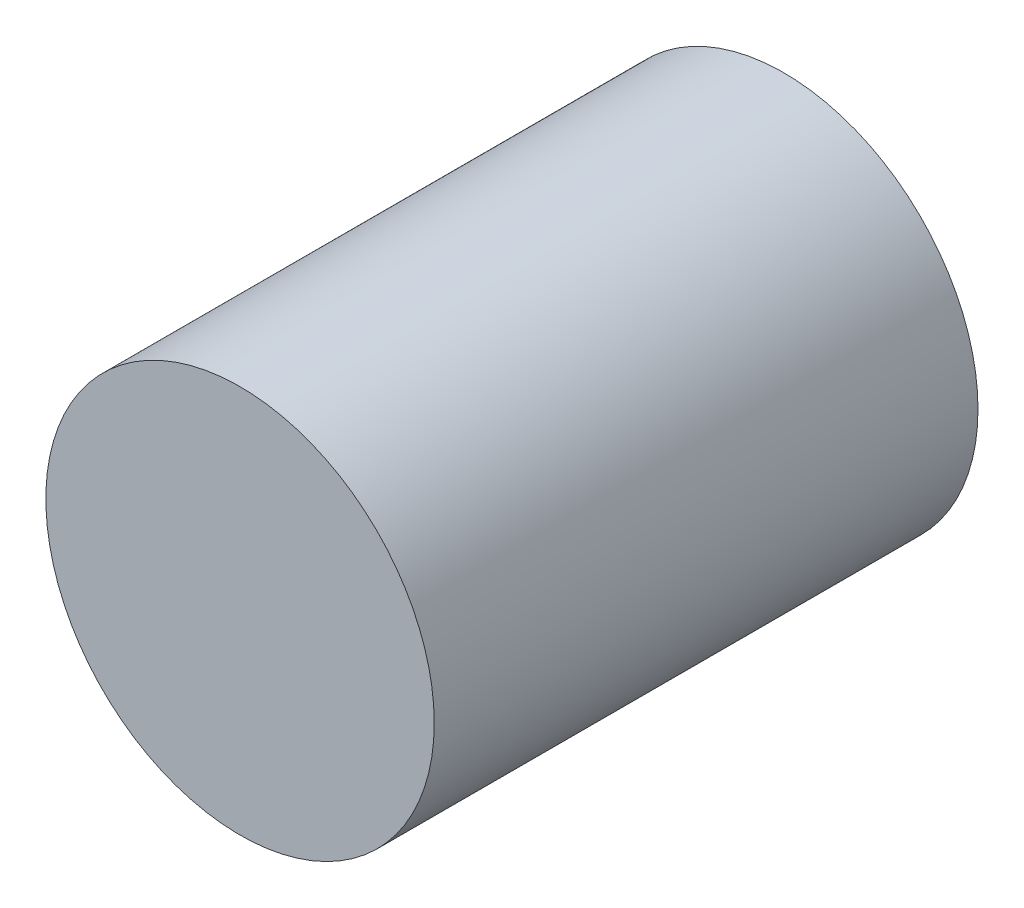
ISO-10303-21;
HEADER;
FILE_DESCRIPTION(('STEP AP214'),'2;1');
FILE_NAME('part.step','',(''),(''),'','','');
FILE_SCHEMA(('AUTOMOTIVE_DESIGN { 1 0 10303 214 1 1 1 1 }'));
ENDSEC;
DATA;
#1=APPLICATION_CONTEXT('core data for automotive mechanical design processes');
#2=APPLICATION_PROTOCOL_DEFINITION('international standard','automotive_design',2000,#1);
#3=PRODUCT_CONTEXT('',#1,'mechanical');
#4=PRODUCT('Part','Part','',(#3));
#5=PRODUCT_RELATED_PRODUCT_CATEGORY('part','',(#4));
#6=PRODUCT_DEFINITION_FORMATION('','',#4);
#7=PRODUCT_DEFINITION_CONTEXT('part definition',#1,'design');
#8=PRODUCT_DEFINITION('design','',#6,#7);
#9=PRODUCT_DEFINITION_SHAPE('','',#8);
#10=(LENGTH_UNIT() NAMED_UNIT(*) SI_UNIT(.MILLI.,.METRE.));
#11=(NAMED_UNIT(*) PLANE_ANGLE_UNIT() SI_UNIT($,.RADIAN.));
#12=(NAMED_UNIT(*) SI_UNIT($,.STERADIAN.) SOLID_ANGLE_UNIT());
#13=UNCERTAINTY_MEASURE_WITH_UNIT(LENGTH_MEASURE(1.E-05),#10,'distance_accuracy_value','');
#14=(GEOMETRIC_REPRESENTATION_CONTEXT(3) GLOBAL_UNCERTAINTY_ASSIGNED_CONTEXT((#13)) GLOBAL_UNIT_ASSIGNED_CONTEXT((#10,
#11,#12)) REPRESENTATION_CONTEXT('',''));
#15=CARTESIAN_POINT('',(0.,0.,0.));
#16=DIRECTION('',(0.,0.,1.));
#17=DIRECTION('',(1.,0.,0.));
#18=AXIS2_PLACEMENT_3D('',#15,#16,#17);
#19=CARTESIAN_POINT('',(0.,0.,14.));
#20=DIRECTION('',(0.,0.,-1.));
#21=DIRECTION('',(-1.,0.,0.));
#22=AXIS2_PLACEMENT_3D('',#19,#20,#21);
#23=CYLINDRICAL_SURFACE('',#22,5.);
#24=CARTESIAN_POINT('',(0.,0.,14.));
#25=DIRECTION('',(0.,0.,1.));
#26=DIRECTION('',(1.,0.,0.));
#27=AXIS2_PLACEMENT_3D('',#24,#25,#26);
#28=CIRCLE('',#27,5.);
#29=CARTESIAN_POINT('',(5.,0.,14.));
#30=VERTEX_POINT('',#29);
#31=EDGE_CURVE('E10',#30,#30,#28,.T.);
#32=ORIENTED_EDGE('',*,*,#31,.F.);
#33=EDGE_LOOP('',(#32));
#34=FACE_BOUND('',#33,.T.);
#35=CARTESIAN_POINT('',(0.,0.,0.));
#36=DIRECTION('',(0.,0.,1.));
#37=DIRECTION('',(1.,0.,0.));
#38=AXIS2_PLACEMENT_3D('',#35,#36,#37);
#39=CIRCLE('',#38,5.);
#40=CARTESIAN_POINT('',(5.,0.,0.));
#41=VERTEX_POINT('',#40);
#42=EDGE_CURVE('E38',#41,#41,#39,.T.);
#43=ORIENTED_EDGE('',*,*,#42,.T.);
#44=EDGE_LOOP('',(#43));
#45=FACE_BOUND('',#44,.T.);
#46=ADVANCED_FACE('F35',(#34,#45),#23,.T.);
#47=CARTESIAN_POINT('',(0.,0.,14.));
#48=DIRECTION('',(0.,0.,1.));
#49=DIRECTION('',(1.,0.,0.));
#50=AXIS2_PLACEMENT_3D('',#47,#48,#49);
#51=PLANE('',#50);
#52=ORIENTED_EDGE('',*,*,#31,.T.);
#53=EDGE_LOOP('',(#52));
#54=FACE_BOUND('',#53,.T.);
#55=ADVANCED_FACE('F52',(#54),#51,.T.);
#56=CARTESIAN_POINT('',(0.,0.,0.));
#57=DIRECTION('',(0.,0.,1.));
#58=DIRECTION('',(1.,0.,0.));
#59=AXIS2_PLACEMENT_3D('',#56,#57,#58);
#60=PLANE('',#59);
#61=ORIENTED_EDGE('',*,*,#42,.F.);
#62=EDGE_LOOP('',(#61));
#63=FACE_BOUND('',#62,.T.);
#64=ADVANCED_FACE('F50',(#63),#60,.F.);
#65=CLOSED_SHELL('',(#46,#55,#64));
#66=MANIFOLD_SOLID_BREP('B2',#65);
#67=ADVANCED_BREP_SHAPE_REPRESENTATION('',(#18,#66),#14);
#68=SHAPE_DEFINITION_REPRESENTATION(#9,#67);
ENDSEC;
END-ISO-10303-21;
